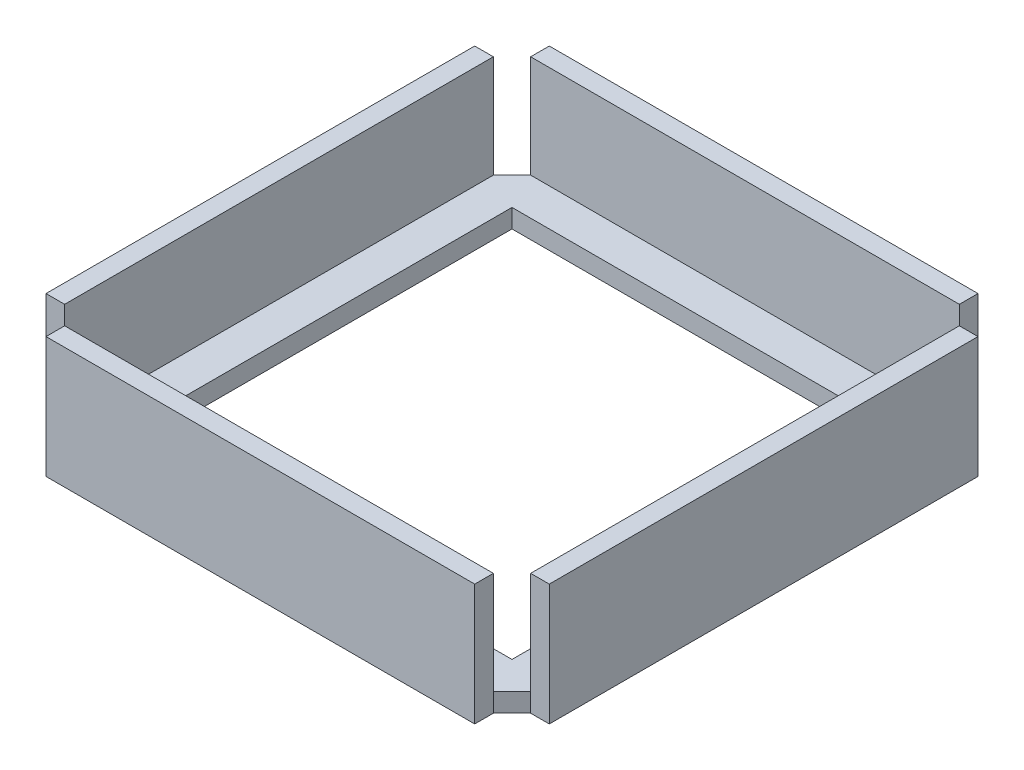
ISO-10303-21;
HEADER;
FILE_DESCRIPTION(('STEP AP214'),'2;1');
FILE_NAME('part.step','',(''),(''),'','','');
FILE_SCHEMA(('AUTOMOTIVE_DESIGN { 1 0 10303 214 1 1 1 1 }'));
ENDSEC;
DATA;
#1=APPLICATION_CONTEXT('core data for automotive mechanical design processes');
#2=APPLICATION_PROTOCOL_DEFINITION('international standard','automotive_design',2000,#1);
#3=PRODUCT_CONTEXT('',#1,'mechanical');
#4=PRODUCT('Part','Part','',(#3));
#5=PRODUCT_RELATED_PRODUCT_CATEGORY('part','',(#4));
#6=PRODUCT_DEFINITION_FORMATION('','',#4);
#7=PRODUCT_DEFINITION_CONTEXT('part definition',#1,'design');
#8=PRODUCT_DEFINITION('design','',#6,#7);
#9=PRODUCT_DEFINITION_SHAPE('','',#8);
#10=(LENGTH_UNIT() NAMED_UNIT(*) SI_UNIT(.MILLI.,.METRE.));
#11=(NAMED_UNIT(*) PLANE_ANGLE_UNIT() SI_UNIT($,.RADIAN.));
#12=(NAMED_UNIT(*) SI_UNIT($,.STERADIAN.) SOLID_ANGLE_UNIT());
#13=UNCERTAINTY_MEASURE_WITH_UNIT(LENGTH_MEASURE(1.E-05),#10,'distance_accuracy_value','');
#14=(GEOMETRIC_REPRESENTATION_CONTEXT(3) GLOBAL_UNCERTAINTY_ASSIGNED_CONTEXT((#13)) GLOBAL_UNIT_ASSIGNED_CONTEXT((#10,
#11,#12)) REPRESENTATION_CONTEXT('',''));
#15=CARTESIAN_POINT('',(0.,0.,0.));
#16=DIRECTION('',(0.,0.,1.));
#17=DIRECTION('',(1.,0.,0.));
#18=AXIS2_PLACEMENT_3D('',#15,#16,#17);
#19=CARTESIAN_POINT('',(-36.5000000000032,2.,-36.5000000000032));
#20=DIRECTION('',(0.707106781186547,0.,0.707106781186548));
#21=DIRECTION('',(0.707106781186548,0.,-0.707106781186547));
#22=AXIS2_PLACEMENT_3D('',#19,#20,#21);
#23=PLANE('',#22);
#24=DIRECTION('',(-0.707106781186548,0.,0.707106781186547));
#25=VECTOR('',#24,1.);
#26=CARTESIAN_POINT('',(-36.5000000000032,0.,-36.5000000000032));
#27=LINE('',#26,#25);
#28=CARTESIAN_POINT('',(-42.0000000000064,0.,-31.));
#29=VERTEX_POINT('',#28);
#30=CARTESIAN_POINT('',(-44.0000000000064,0.,-29.));
#31=VERTEX_POINT('',#30);
#32=EDGE_CURVE('E313',#29,#31,#27,.T.);
#33=ORIENTED_EDGE('',*,*,#32,.T.);
#34=DIRECTION('',(0.,-1.,0.));
#35=VECTOR('',#34,1.);
#36=CARTESIAN_POINT('',(-44.0000000000064,2.,-29.));
#37=LINE('',#36,#35);
#38=CARTESIAN_POINT('',(-44.0000000000064,2.00000000000001,-29.));
#39=VERTEX_POINT('',#38);
#40=EDGE_CURVE('E11',#39,#31,#37,.T.);
#41=ORIENTED_EDGE('',*,*,#40,.F.);
#42=DIRECTION('',(-0.707106781186548,0.,0.707106781186547));
#43=VECTOR('',#42,1.);
#44=CARTESIAN_POINT('',(-36.5000000000032,2.,-36.5000000000032));
#45=LINE('',#44,#43);
#46=CARTESIAN_POINT('',(-42.0000000000064,2.,-31.));
#47=VERTEX_POINT('',#46);
#48=EDGE_CURVE('E268',#47,#39,#45,.T.);
#49=ORIENTED_EDGE('',*,*,#48,.F.);
#50=DIRECTION('',(0.,-1.,0.));
#51=VECTOR('',#50,1.);
#52=CARTESIAN_POINT('',(-42.0000000000064,2.,-31.));
#53=LINE('',#52,#51);
#54=EDGE_CURVE('E241',#47,#29,#53,.T.);
#55=ORIENTED_EDGE('',*,*,#54,.T.);
#56=EDGE_LOOP('',(#33,#41,#49,#55));
#57=FACE_BOUND('',#56,.T.);
#58=ADVANCED_FACE('F34',(#57),#23,.F.);
#59=CARTESIAN_POINT('',(-30.5000000000028,2.,30.5000000000028));
#60=DIRECTION('',(0.707106781186547,0.,-0.707106781186547));
#61=DIRECTION('',(-0.707106781186548,0.,-0.707106781186548));
#62=AXIS2_PLACEMENT_3D('',#59,#60,#61);
#63=PLANE('',#62);
#64=DIRECTION('',(0.707106781186548,0.,0.707106781186548));
#65=VECTOR('',#64,1.);
#66=CARTESIAN_POINT('',(-30.5000000000028,0.,30.5000000000028));
#67=LINE('',#66,#65);
#68=CARTESIAN_POINT('',(-44.0000000000064,0.,16.9999999999992));
#69=VERTEX_POINT('',#68);
#70=CARTESIAN_POINT('',(-42.0000000000064,0.,18.9999999999992));
#71=VERTEX_POINT('',#70);
#72=EDGE_CURVE('E77',#69,#71,#67,.T.);
#73=ORIENTED_EDGE('',*,*,#72,.T.);
#74=DIRECTION('',(0.,-1.,0.));
#75=VECTOR('',#74,1.);
#76=CARTESIAN_POINT('',(-42.0000000000064,2.,18.9999999999992));
#77=LINE('',#76,#75);
#78=CARTESIAN_POINT('',(-42.0000000000064,2.00000000000001,18.9999999999992));
#79=VERTEX_POINT('',#78);
#80=EDGE_CURVE('E143',#79,#71,#77,.T.);
#81=ORIENTED_EDGE('',*,*,#80,.F.);
#82=DIRECTION('',(0.707106781186548,0.,0.707106781186548));
#83=VECTOR('',#82,1.);
#84=CARTESIAN_POINT('',(-30.5000000000028,2.,30.5000000000028));
#85=LINE('',#84,#83);
#86=CARTESIAN_POINT('',(-44.0000000000064,2.,16.9999999999992));
#87=VERTEX_POINT('',#86);
#88=EDGE_CURVE('E127',#87,#79,#85,.T.);
#89=ORIENTED_EDGE('',*,*,#88,.F.);
#90=DIRECTION('',(0.,-1.,0.));
#91=VECTOR('',#90,1.);
#92=CARTESIAN_POINT('',(-44.0000000000064,2.,16.9999999999992));
#93=LINE('',#92,#91);
#94=EDGE_CURVE('E44',#87,#69,#93,.T.);
#95=ORIENTED_EDGE('',*,*,#94,.T.);
#96=EDGE_LOOP('',(#73,#81,#89,#95));
#97=FACE_BOUND('',#96,.T.);
#98=ADVANCED_FACE('F347',(#97),#63,.F.);
#99=CARTESIAN_POINT('',(11.4999999999964,2.,11.4999999999964));
#100=DIRECTION('',(-0.707106781186549,0.,-0.707106781186546));
#101=DIRECTION('',(-0.707106781186546,0.,0.707106781186549));
#102=AXIS2_PLACEMENT_3D('',#99,#100,#101);
#103=PLANE('',#102);
#104=DIRECTION('',(0.707106781186546,0.,-0.707106781186549));
#105=VECTOR('',#104,1.);
#106=CARTESIAN_POINT('',(11.4999999999964,0.,11.4999999999964));
#107=LINE('',#106,#105);
#108=CARTESIAN_POINT('',(3.99999999999364,0.,18.9999999999992));
#109=VERTEX_POINT('',#108);
#110=CARTESIAN_POINT('',(5.99999999999363,0.,16.9999999999992));
#111=VERTEX_POINT('',#110);
#112=EDGE_CURVE('E310',#109,#111,#107,.T.);
#113=ORIENTED_EDGE('',*,*,#112,.T.);
#114=DIRECTION('',(0.,-1.,0.));
#115=VECTOR('',#114,1.);
#116=CARTESIAN_POINT('',(5.99999999999363,2.,16.9999999999992));
#117=LINE('',#116,#115);
#118=CARTESIAN_POINT('',(5.99999999999363,2.00000000000001,16.9999999999992));
#119=VERTEX_POINT('',#118);
#120=EDGE_CURVE('E115',#119,#111,#117,.T.);
#121=ORIENTED_EDGE('',*,*,#120,.F.);
#122=DIRECTION('',(0.707106781186546,0.,-0.707106781186549));
#123=VECTOR('',#122,1.);
#124=CARTESIAN_POINT('',(11.4999999999964,2.,11.4999999999964));
#125=LINE('',#124,#123);
#126=CARTESIAN_POINT('',(3.99999999999364,2.,18.9999999999992));
#127=VERTEX_POINT('',#126);
#128=EDGE_CURVE('E110',#127,#119,#125,.T.);
#129=ORIENTED_EDGE('',*,*,#128,.F.);
#130=DIRECTION('',(0.,-1.,0.));
#131=VECTOR('',#130,1.);
#132=CARTESIAN_POINT('',(3.99999999999364,2.,18.9999999999992));
#133=LINE('',#132,#131);
#134=EDGE_CURVE('E85',#127,#109,#133,.T.);
#135=ORIENTED_EDGE('',*,*,#134,.T.);
#136=EDGE_LOOP('',(#113,#121,#129,#135));
#137=FACE_BOUND('',#136,.T.);
#138=ADVANCED_FACE('F112',(#137),#103,.F.);
#139=CARTESIAN_POINT('',(17.4999999999968,2.,-17.4999999999969));
#140=DIRECTION('',(-0.707106781186547,0.,0.707106781186548));
#141=DIRECTION('',(0.707106781186548,0.,0.707106781186547));
#142=AXIS2_PLACEMENT_3D('',#139,#140,#141);
#143=PLANE('',#142);
#144=DIRECTION('',(-0.707106781186548,0.,-0.707106781186547));
#145=VECTOR('',#144,1.);
#146=CARTESIAN_POINT('',(17.4999999999968,0.,-17.4999999999969));
#147=LINE('',#146,#145);
#148=CARTESIAN_POINT('',(5.99999999999364,0.,-29.));
#149=VERTEX_POINT('',#148);
#150=CARTESIAN_POINT('',(3.99999999999364,0.,-31.));
#151=VERTEX_POINT('',#150);
#152=EDGE_CURVE('E239',#149,#151,#147,.T.);
#153=ORIENTED_EDGE('',*,*,#152,.T.);
#154=DIRECTION('',(0.,-1.,0.));
#155=VECTOR('',#154,1.);
#156=CARTESIAN_POINT('',(3.99999999999364,2.,-31.));
#157=LINE('',#156,#155);
#158=CARTESIAN_POINT('',(3.99999999999364,2.00000000000001,-31.));
#159=VERTEX_POINT('',#158);
#160=EDGE_CURVE('E218',#159,#151,#157,.T.);
#161=ORIENTED_EDGE('',*,*,#160,.F.);
#162=DIRECTION('',(-0.707106781186548,0.,-0.707106781186547));
#163=VECTOR('',#162,1.);
#164=CARTESIAN_POINT('',(17.4999999999968,2.,-17.4999999999969));
#165=LINE('',#164,#163);
#166=CARTESIAN_POINT('',(5.99999999999364,2.,-29.));
#167=VERTEX_POINT('',#166);
#168=EDGE_CURVE('E229',#167,#159,#165,.T.);
#169=ORIENTED_EDGE('',*,*,#168,.F.);
#170=DIRECTION('',(0.,-1.,0.));
#171=VECTOR('',#170,1.);
#172=CARTESIAN_POINT('',(5.99999999999364,2.,-29.));
#173=LINE('',#172,#171);
#174=EDGE_CURVE('E240',#167,#149,#173,.T.);
#175=ORIENTED_EDGE('',*,*,#174,.T.);
#176=EDGE_LOOP('',(#153,#161,#169,#175));
#177=FACE_BOUND('',#176,.T.);
#178=ADVANCED_FACE('F237',(#177),#143,.F.);
#179=CARTESIAN_POINT('',(0.,2.,-27.));
#180=DIRECTION('',(0.,0.,-1.));
#181=DIRECTION('',(-1.,0.,0.));
#182=AXIS2_PLACEMENT_3D('',#179,#180,#181);
#183=PLANE('',#182);
#184=DIRECTION('',(1.,0.,0.));
#185=VECTOR('',#184,1.);
#186=CARTESIAN_POINT('',(0.,0.,-27.));
#187=LINE('',#186,#185);
#188=CARTESIAN_POINT('',(-40.,0.,-27.));
#189=VERTEX_POINT('',#188);
#190=CARTESIAN_POINT('',(1.99999999999999,0.,-27.));
#191=VERTEX_POINT('',#190);
#192=EDGE_CURVE('E150',#189,#191,#187,.T.);
#193=ORIENTED_EDGE('',*,*,#192,.T.);
#194=DIRECTION('',(0.,-1.,0.));
#195=VECTOR('',#194,1.);
#196=CARTESIAN_POINT('',(1.99999999999999,2.,-27.));
#197=LINE('',#196,#195);
#198=CARTESIAN_POINT('',(1.99999999999999,2.,-27.));
#199=VERTEX_POINT('',#198);
#200=EDGE_CURVE('E245',#199,#191,#197,.T.);
#201=ORIENTED_EDGE('',*,*,#200,.F.);
#202=DIRECTION('',(1.,0.,0.));
#203=VECTOR('',#202,1.);
#204=CARTESIAN_POINT('',(0.,2.,-27.));
#205=LINE('',#204,#203);
#206=CARTESIAN_POINT('',(-40.,2.,-27.));
#207=VERTEX_POINT('',#206);
#208=EDGE_CURVE('E161',#207,#199,#205,.T.);
#209=ORIENTED_EDGE('',*,*,#208,.F.);
#210=DIRECTION('',(0.,-1.,0.));
#211=VECTOR('',#210,1.);
#212=CARTESIAN_POINT('',(-40.,2.,-27.));
#213=LINE('',#212,#211);
#214=EDGE_CURVE('E263',#207,#189,#213,.T.);
#215=ORIENTED_EDGE('',*,*,#214,.T.);
#216=EDGE_LOOP('',(#193,#201,#209,#215));
#217=FACE_BOUND('',#216,.T.);
#218=ADVANCED_FACE('F36',(#217),#183,.F.);
#219=CARTESIAN_POINT('',(2.,2.,0.));
#220=DIRECTION('',(1.,0.,0.));
#221=DIRECTION('',(0.,0.,-1.));
#222=AXIS2_PLACEMENT_3D('',#219,#220,#221);
#223=PLANE('',#222);
#224=DIRECTION('',(0.,0.,1.));
#225=VECTOR('',#224,1.);
#226=CARTESIAN_POINT('',(2.,0.,0.));
#227=LINE('',#226,#225);
#228=CARTESIAN_POINT('',(2.,0.,15.));
#229=VERTEX_POINT('',#228);
#230=EDGE_CURVE('E154',#191,#229,#227,.T.);
#231=ORIENTED_EDGE('',*,*,#230,.T.);
#232=DIRECTION('',(0.,-1.,0.));
#233=VECTOR('',#232,1.);
#234=CARTESIAN_POINT('',(2.,2.,15.));
#235=LINE('',#234,#233);
#236=CARTESIAN_POINT('',(2.,2.,15.));
#237=VERTEX_POINT('',#236);
#238=EDGE_CURVE('E304',#237,#229,#235,.T.);
#239=ORIENTED_EDGE('',*,*,#238,.F.);
#240=DIRECTION('',(0.,0.,1.));
#241=VECTOR('',#240,1.);
#242=CARTESIAN_POINT('',(2.,2.,0.));
#243=LINE('',#242,#241);
#244=EDGE_CURVE('E94',#199,#237,#243,.T.);
#245=ORIENTED_EDGE('',*,*,#244,.F.);
#246=ORIENTED_EDGE('',*,*,#200,.T.);
#247=EDGE_LOOP('',(#231,#239,#245,#246));
#248=FACE_BOUND('',#247,.T.);
#249=ADVANCED_FACE('F322',(#248),#223,.F.);
#250=CARTESIAN_POINT('',(0.,2.,15.));
#251=DIRECTION('',(0.,0.,-1.));
#252=DIRECTION('',(-1.,0.,0.));
#253=AXIS2_PLACEMENT_3D('',#250,#251,#252);
#254=PLANE('',#253);
#255=DIRECTION('',(1.,0.,0.));
#256=VECTOR('',#255,1.);
#257=CARTESIAN_POINT('',(0.,0.,15.));
#258=LINE('',#257,#256);
#259=CARTESIAN_POINT('',(-40.,0.,15.));
#260=VERTEX_POINT('',#259);
#261=EDGE_CURVE('E319',#260,#229,#258,.T.);
#262=ORIENTED_EDGE('',*,*,#261,.F.);
#263=DIRECTION('',(0.,-1.,0.));
#264=VECTOR('',#263,1.);
#265=CARTESIAN_POINT('',(-40.,2.,15.));
#266=LINE('',#265,#264);
#267=CARTESIAN_POINT('',(-40.,2.,15.));
#268=VERTEX_POINT('',#267);
#269=EDGE_CURVE('E306',#268,#260,#266,.T.);
#270=ORIENTED_EDGE('',*,*,#269,.F.);
#271=DIRECTION('',(1.,0.,0.));
#272=VECTOR('',#271,1.);
#273=CARTESIAN_POINT('',(0.,2.,15.));
#274=LINE('',#273,#272);
#275=EDGE_CURVE('E277',#268,#237,#274,.T.);
#276=ORIENTED_EDGE('',*,*,#275,.T.);
#277=ORIENTED_EDGE('',*,*,#238,.T.);
#278=EDGE_LOOP('',(#262,#270,#276,#277));
#279=FACE_BOUND('',#278,.T.);
#280=ADVANCED_FACE('F331',(#279),#254,.T.);
#281=CARTESIAN_POINT('',(-40.,2.,0.));
#282=DIRECTION('',(1.,0.,0.));
#283=DIRECTION('',(0.,0.,-1.));
#284=AXIS2_PLACEMENT_3D('',#281,#282,#283);
#285=PLANE('',#284);
#286=DIRECTION('',(0.,0.,1.));
#287=VECTOR('',#286,1.);
#288=CARTESIAN_POINT('',(-40.,0.,0.));
#289=LINE('',#288,#287);
#290=EDGE_CURVE('E316',#189,#260,#289,.T.);
#291=ORIENTED_EDGE('',*,*,#290,.F.);
#292=ORIENTED_EDGE('',*,*,#214,.F.);
#293=DIRECTION('',(0.,0.,1.));
#294=VECTOR('',#293,1.);
#295=CARTESIAN_POINT('',(-40.,2.,0.));
#296=LINE('',#295,#294);
#297=EDGE_CURVE('E271',#207,#268,#296,.T.);
#298=ORIENTED_EDGE('',*,*,#297,.T.);
#299=ORIENTED_EDGE('',*,*,#269,.T.);
#300=EDGE_LOOP('',(#291,#292,#298,#299));
#301=FACE_BOUND('',#300,.T.);
#302=ADVANCED_FACE('F336',(#301),#285,.T.);
#303=CARTESIAN_POINT('',(0.,2.,0.));
#304=DIRECTION('',(0.,1.,0.));
#305=DIRECTION('',(0.,0.,1.));
#306=AXIS2_PLACEMENT_3D('',#303,#304,#305);
#307=PLANE('',#306);
#308=ORIENTED_EDGE('',*,*,#208,.T.);
#309=ORIENTED_EDGE('',*,*,#244,.T.);
#310=ORIENTED_EDGE('',*,*,#275,.F.);
#311=ORIENTED_EDGE('',*,*,#297,.F.);
#312=EDGE_LOOP('',(#308,#309,#310,#311));
#313=FACE_BOUND('',#312,.T.);
#314=ORIENTED_EDGE('',*,*,#48,.T.);
#315=DIRECTION('',(0.,0.,1.));
#316=VECTOR('',#315,1.);
#317=CARTESIAN_POINT('',(-44.0000000000064,2.,0.));
#318=LINE('',#317,#316);
#319=EDGE_CURVE('E270',#39,#87,#318,.T.);
#320=ORIENTED_EDGE('',*,*,#319,.T.);
#321=ORIENTED_EDGE('',*,*,#88,.T.);
#322=DIRECTION('',(-1.,0.,0.));
#323=VECTOR('',#322,1.);
#324=CARTESIAN_POINT('',(0.,2.,18.9999999999992));
#325=LINE('',#324,#323);
#326=EDGE_CURVE('E119',#127,#79,#325,.T.);
#327=ORIENTED_EDGE('',*,*,#326,.F.);
#328=ORIENTED_EDGE('',*,*,#128,.T.);
#329=DIRECTION('',(0.,0.,-1.));
#330=VECTOR('',#329,1.);
#331=CARTESIAN_POINT('',(5.99999999999363,2.,0.));
#332=LINE('',#331,#330);
#333=EDGE_CURVE('E118',#119,#167,#332,.T.);
#334=ORIENTED_EDGE('',*,*,#333,.T.);
#335=ORIENTED_EDGE('',*,*,#168,.T.);
#336=DIRECTION('',(-1.,0.,0.));
#337=VECTOR('',#336,1.);
#338=CARTESIAN_POINT('',(0.,2.,-31.));
#339=LINE('',#338,#337);
#340=EDGE_CURVE('E230',#159,#47,#339,.T.);
#341=ORIENTED_EDGE('',*,*,#340,.T.);
#342=EDGE_LOOP('',(#314,#320,#321,#327,#328,#334,#335,#341));
#343=FACE_BOUND('',#342,.T.);
#344=ADVANCED_FACE('F124',(#313,#343),#307,.T.);
#345=CARTESIAN_POINT('',(0.,0.,0.));
#346=DIRECTION('',(0.,1.,0.));
#347=DIRECTION('',(0.,0.,1.));
#348=AXIS2_PLACEMENT_3D('',#345,#346,#347);
#349=PLANE('',#348);
#350=ORIENTED_EDGE('',*,*,#192,.F.);
#351=ORIENTED_EDGE('',*,*,#290,.T.);
#352=ORIENTED_EDGE('',*,*,#261,.T.);
#353=ORIENTED_EDGE('',*,*,#230,.F.);
#354=EDGE_LOOP('',(#350,#351,#352,#353));
#355=FACE_BOUND('',#354,.T.);
#356=ORIENTED_EDGE('',*,*,#32,.F.);
#357=DIRECTION('',(0.,0.,1.));
#358=VECTOR('',#357,1.);
#359=CARTESIAN_POINT('',(-42.0000000000064,0.,0.));
#360=LINE('',#359,#358);
#361=CARTESIAN_POINT('',(-42.0000000000064,0.,-33.0000000000312));
#362=VERTEX_POINT('',#361);
#363=EDGE_CURVE('E195',#362,#29,#360,.T.);
#364=ORIENTED_EDGE('',*,*,#363,.F.);
#365=DIRECTION('',(1.,0.,0.));
#366=VECTOR('',#365,1.);
#367=CARTESIAN_POINT('',(0.,0.,-33.0000000000312));
#368=LINE('',#367,#366);
#369=CARTESIAN_POINT('',(3.99999999999364,0.,-33.0000000000312));
#370=VERTEX_POINT('',#369);
#371=EDGE_CURVE('E513',#362,#370,#368,.T.);
#372=ORIENTED_EDGE('',*,*,#371,.T.);
#373=DIRECTION('',(0.,0.,1.));
#374=VECTOR('',#373,1.);
#375=CARTESIAN_POINT('',(3.99999999999367,0.,0.));
#376=LINE('',#375,#374);
#377=EDGE_CURVE('E512',#370,#151,#376,.T.);
#378=ORIENTED_EDGE('',*,*,#377,.T.);
#379=ORIENTED_EDGE('',*,*,#152,.F.);
#380=DIRECTION('',(1.,0.,0.));
#381=VECTOR('',#380,1.);
#382=CARTESIAN_POINT('',(0.,0.,-29.));
#383=LINE('',#382,#381);
#384=CARTESIAN_POINT('',(8.00000000000005,0.,-29.));
#385=VERTEX_POINT('',#384);
#386=EDGE_CURVE('E478',#149,#385,#383,.T.);
#387=ORIENTED_EDGE('',*,*,#386,.T.);
#388=DIRECTION('',(0.,0.,1.));
#389=VECTOR('',#388,1.);
#390=CARTESIAN_POINT('',(8.00000000000006,0.,0.));
#391=LINE('',#390,#389);
#392=CARTESIAN_POINT('',(8.00000000000006,0.,16.9999999999992));
#393=VERTEX_POINT('',#392);
#394=EDGE_CURVE('E491',#385,#393,#391,.T.);
#395=ORIENTED_EDGE('',*,*,#394,.T.);
#396=DIRECTION('',(-1.,0.,0.));
#397=VECTOR('',#396,1.);
#398=CARTESIAN_POINT('',(0.,0.,16.9999999999992));
#399=LINE('',#398,#397);
#400=EDGE_CURVE('E488',#393,#111,#399,.T.);
#401=ORIENTED_EDGE('',*,*,#400,.T.);
#402=ORIENTED_EDGE('',*,*,#112,.F.);
#403=DIRECTION('',(0.,0.,-1.));
#404=VECTOR('',#403,1.);
#405=CARTESIAN_POINT('',(3.99999999999364,0.,0.));
#406=LINE('',#405,#404);
#407=CARTESIAN_POINT('',(3.99999999999364,0.,20.9999999999621));
#408=VERTEX_POINT('',#407);
#409=EDGE_CURVE('E142',#408,#109,#406,.T.);
#410=ORIENTED_EDGE('',*,*,#409,.F.);
#411=DIRECTION('',(1.,0.,0.));
#412=VECTOR('',#411,1.);
#413=CARTESIAN_POINT('',(0.,0.,20.9999999999621));
#414=LINE('',#413,#412);
#415=CARTESIAN_POINT('',(-42.0000000000064,0.,20.9999999999621));
#416=VERTEX_POINT('',#415);
#417=EDGE_CURVE('E171',#416,#408,#414,.T.);
#418=ORIENTED_EDGE('',*,*,#417,.F.);
#419=DIRECTION('',(0.,0.,-1.));
#420=VECTOR('',#419,1.);
#421=CARTESIAN_POINT('',(-42.0000000000064,0.,0.));
#422=LINE('',#421,#420);
#423=EDGE_CURVE('E175',#416,#71,#422,.T.);
#424=ORIENTED_EDGE('',*,*,#423,.T.);
#425=ORIENTED_EDGE('',*,*,#72,.F.);
#426=DIRECTION('',(1.,0.,0.));
#427=VECTOR('',#426,1.);
#428=CARTESIAN_POINT('',(0.,0.,16.9999999999992));
#429=LINE('',#428,#427);
#430=CARTESIAN_POINT('',(-45.9999999999914,0.,16.9999999999992));
#431=VERTEX_POINT('',#430);
#432=EDGE_CURVE('E449',#431,#69,#429,.T.);
#433=ORIENTED_EDGE('',*,*,#432,.F.);
#434=DIRECTION('',(0.,0.,1.));
#435=VECTOR('',#434,1.);
#436=CARTESIAN_POINT('',(-45.9999999999914,0.,0.));
#437=LINE('',#436,#435);
#438=CARTESIAN_POINT('',(-45.9999999999914,0.,-29.));
#439=VERTEX_POINT('',#438);
#440=EDGE_CURVE('E454',#439,#431,#437,.T.);
#441=ORIENTED_EDGE('',*,*,#440,.F.);
#442=DIRECTION('',(-1.,0.,0.));
#443=VECTOR('',#442,1.);
#444=CARTESIAN_POINT('',(0.,0.,-29.0000000000001));
#445=LINE('',#444,#443);
#446=EDGE_CURVE('E460',#31,#439,#445,.T.);
#447=ORIENTED_EDGE('',*,*,#446,.F.);
#448=EDGE_LOOP('',(#356,#364,#372,#378,#379,#387,#395,#401,#402,#410,#418,#424,#425,#433,#441,#447));
#449=FACE_BOUND('',#448,.T.);
#450=ADVANCED_FACE('F327',(#355,#449),#349,.F.);
#451=CARTESIAN_POINT('',(0.,13.,18.9999999999992));
#452=DIRECTION('',(0.,0.,1.));
#453=DIRECTION('',(1.,0.,0.));
#454=AXIS2_PLACEMENT_3D('',#451,#452,#453);
#455=PLANE('',#454);
#456=DIRECTION('',(0.,-1.,0.));
#457=VECTOR('',#456,1.);
#458=CARTESIAN_POINT('',(3.99999999999364,13.,18.9999999999992));
#459=LINE('',#458,#457);
#460=CARTESIAN_POINT('',(3.99999999999364,13.,18.9999999999992));
#461=VERTEX_POINT('',#460);
#462=EDGE_CURVE('E139',#461,#127,#459,.T.);
#463=ORIENTED_EDGE('',*,*,#462,.T.);
#464=ORIENTED_EDGE('',*,*,#326,.T.);
#465=DIRECTION('',(0.,-1.,0.));
#466=VECTOR('',#465,1.);
#467=CARTESIAN_POINT('',(-42.0000000000064,13.,18.9999999999992));
#468=LINE('',#467,#466);
#469=CARTESIAN_POINT('',(-42.0000000000064,13.,18.9999999999992));
#470=VERTEX_POINT('',#469);
#471=EDGE_CURVE('E151',#470,#79,#468,.T.);
#472=ORIENTED_EDGE('',*,*,#471,.F.);
#473=DIRECTION('',(-1.,0.,0.));
#474=VECTOR('',#473,1.);
#475=CARTESIAN_POINT('',(0.,13.,18.9999999999992));
#476=LINE('',#475,#474);
#477=EDGE_CURVE('E148',#461,#470,#476,.T.);
#478=ORIENTED_EDGE('',*,*,#477,.F.);
#479=EDGE_LOOP('',(#463,#464,#472,#478));
#480=FACE_BOUND('',#479,.T.);
#481=ADVANCED_FACE('F146',(#480),#455,.F.);
#482=CARTESIAN_POINT('',(3.99999999999364,13.,0.));
#483=DIRECTION('',(-1.,0.,0.));
#484=DIRECTION('',(0.,0.,1.));
#485=AXIS2_PLACEMENT_3D('',#482,#483,#484);
#486=PLANE('',#485);
#487=ORIENTED_EDGE('',*,*,#409,.T.);
#488=ORIENTED_EDGE('',*,*,#134,.F.);
#489=ORIENTED_EDGE('',*,*,#462,.F.);
#490=DIRECTION('',(0.,0.,-1.));
#491=VECTOR('',#490,1.);
#492=CARTESIAN_POINT('',(3.99999999999364,13.,0.));
#493=LINE('',#492,#491);
#494=CARTESIAN_POINT('',(3.99999999999364,13.,20.9999999999621));
#495=VERTEX_POINT('',#494);
#496=EDGE_CURVE('E174',#495,#461,#493,.T.);
#497=ORIENTED_EDGE('',*,*,#496,.F.);
#498=DIRECTION('',(0.,-1.,0.));
#499=VECTOR('',#498,1.);
#500=CARTESIAN_POINT('',(3.99999999999364,13.,20.9999999999621));
#501=LINE('',#500,#499);
#502=EDGE_CURVE('E168',#495,#408,#501,.T.);
#503=ORIENTED_EDGE('',*,*,#502,.T.);
#504=EDGE_LOOP('',(#487,#488,#489,#497,#503));
#505=FACE_BOUND('',#504,.T.);
#506=ADVANCED_FACE('F136',(#505),#486,.F.);
#507=CARTESIAN_POINT('',(-42.0000000000064,13.,0.));
#508=DIRECTION('',(-1.,0.,0.));
#509=DIRECTION('',(0.,0.,1.));
#510=AXIS2_PLACEMENT_3D('',#507,#508,#509);
#511=PLANE('',#510);
#512=ORIENTED_EDGE('',*,*,#423,.F.);
#513=DIRECTION('',(0.,-1.,0.));
#514=VECTOR('',#513,1.);
#515=CARTESIAN_POINT('',(-42.0000000000064,13.,20.9999999999621));
#516=LINE('',#515,#514);
#517=CARTESIAN_POINT('',(-42.0000000000064,13.,20.9999999999621));
#518=VERTEX_POINT('',#517);
#519=EDGE_CURVE('E156',#518,#416,#516,.T.);
#520=ORIENTED_EDGE('',*,*,#519,.F.);
#521=DIRECTION('',(0.,0.,-1.));
#522=VECTOR('',#521,1.);
#523=CARTESIAN_POINT('',(-42.0000000000064,13.,0.));
#524=LINE('',#523,#522);
#525=EDGE_CURVE('E182',#518,#470,#524,.T.);
#526=ORIENTED_EDGE('',*,*,#525,.T.);
#527=ORIENTED_EDGE('',*,*,#471,.T.);
#528=ORIENTED_EDGE('',*,*,#80,.T.);
#529=EDGE_LOOP('',(#512,#520,#526,#527,#528));
#530=FACE_BOUND('',#529,.T.);
#531=ADVANCED_FACE('F362',(#530),#511,.T.);
#532=CARTESIAN_POINT('',(0.,13.,20.9999999999621));
#533=DIRECTION('',(0.,0.,-1.));
#534=DIRECTION('',(-1.,0.,0.));
#535=AXIS2_PLACEMENT_3D('',#532,#533,#534);
#536=PLANE('',#535);
#537=ORIENTED_EDGE('',*,*,#417,.T.);
#538=ORIENTED_EDGE('',*,*,#502,.F.);
#539=DIRECTION('',(1.,0.,0.));
#540=VECTOR('',#539,1.);
#541=CARTESIAN_POINT('',(0.,13.,20.9999999999621));
#542=LINE('',#541,#540);
#543=EDGE_CURVE('E170',#518,#495,#542,.T.);
#544=ORIENTED_EDGE('',*,*,#543,.F.);
#545=ORIENTED_EDGE('',*,*,#519,.T.);
#546=EDGE_LOOP('',(#537,#538,#544,#545));
#547=FACE_BOUND('',#546,.T.);
#548=ADVANCED_FACE('F367',(#547),#536,.F.);
#549=CARTESIAN_POINT('',(0.,13.,0.));
#550=DIRECTION('',(0.,1.,0.));
#551=DIRECTION('',(0.,0.,1.));
#552=AXIS2_PLACEMENT_3D('',#549,#550,#551);
#553=PLANE('',#552);
#554=ORIENTED_EDGE('',*,*,#496,.T.);
#555=ORIENTED_EDGE('',*,*,#477,.T.);
#556=ORIENTED_EDGE('',*,*,#525,.F.);
#557=ORIENTED_EDGE('',*,*,#543,.T.);
#558=EDGE_LOOP('',(#554,#555,#556,#557));
#559=FACE_BOUND('',#558,.T.);
#560=ADVANCED_FACE('F370',(#559),#553,.T.);
#561=CARTESIAN_POINT('',(0.,13.,-31.));
#562=DIRECTION('',(0.,0.,1.));
#563=DIRECTION('',(1.,0.,0.));
#564=AXIS2_PLACEMENT_3D('',#561,#562,#563);
#565=PLANE('',#564);
#566=ORIENTED_EDGE('',*,*,#340,.F.);
#567=DIRECTION('',(0.,-1.,0.));
#568=VECTOR('',#567,1.);
#569=CARTESIAN_POINT('',(3.99999999999364,13.,-31.));
#570=LINE('',#569,#568);
#571=CARTESIAN_POINT('',(3.99999999999364,13.,-31.));
#572=VERTEX_POINT('',#571);
#573=EDGE_CURVE('E179',#572,#159,#570,.T.);
#574=ORIENTED_EDGE('',*,*,#573,.F.);
#575=DIRECTION('',(-1.,0.,0.));
#576=VECTOR('',#575,1.);
#577=CARTESIAN_POINT('',(0.,13.,-31.));
#578=LINE('',#577,#576);
#579=CARTESIAN_POINT('',(-42.0000000000064,13.,-31.));
#580=VERTEX_POINT('',#579);
#581=EDGE_CURVE('E505',#572,#580,#578,.T.);
#582=ORIENTED_EDGE('',*,*,#581,.T.);
#583=DIRECTION('',(0.,-1.,0.));
#584=VECTOR('',#583,1.);
#585=CARTESIAN_POINT('',(-42.0000000000064,13.,-31.));
#586=LINE('',#585,#584);
#587=EDGE_CURVE('E52',#580,#47,#586,.T.);
#588=ORIENTED_EDGE('',*,*,#587,.T.);
#589=EDGE_LOOP('',(#566,#574,#582,#588));
#590=FACE_BOUND('',#589,.T.);
#591=ADVANCED_FACE('F374',(#590),#565,.T.);
#592=CARTESIAN_POINT('',(3.99999999999367,13.,0.));
#593=DIRECTION('',(1.,0.,0.));
#594=DIRECTION('',(0.,0.,-1.));
#595=AXIS2_PLACEMENT_3D('',#592,#593,#594);
#596=PLANE('',#595);
#597=ORIENTED_EDGE('',*,*,#377,.F.);
#598=DIRECTION('',(0.,-1.,0.));
#599=VECTOR('',#598,1.);
#600=CARTESIAN_POINT('',(3.99999999999364,13.,-33.0000000000312));
#601=LINE('',#600,#599);
#602=CARTESIAN_POINT('',(3.99999999999364,13.,-33.0000000000312));
#603=VERTEX_POINT('',#602);
#604=EDGE_CURVE('E199',#603,#370,#601,.T.);
#605=ORIENTED_EDGE('',*,*,#604,.F.);
#606=DIRECTION('',(0.,0.,1.));
#607=VECTOR('',#606,1.);
#608=CARTESIAN_POINT('',(3.99999999999367,13.,0.));
#609=LINE('',#608,#607);
#610=EDGE_CURVE('E222',#603,#572,#609,.T.);
#611=ORIENTED_EDGE('',*,*,#610,.T.);
#612=ORIENTED_EDGE('',*,*,#573,.T.);
#613=ORIENTED_EDGE('',*,*,#160,.T.);
#614=EDGE_LOOP('',(#597,#605,#611,#612,#613));
#615=FACE_BOUND('',#614,.T.);
#616=ADVANCED_FACE('F215',(#615),#596,.T.);
#617=CARTESIAN_POINT('',(0.,13.,-33.0000000000312));
#618=DIRECTION('',(0.,0.,-1.));
#619=DIRECTION('',(-1.,0.,0.));
#620=AXIS2_PLACEMENT_3D('',#617,#618,#619);
#621=PLANE('',#620);
#622=ORIENTED_EDGE('',*,*,#371,.F.);
#623=DIRECTION('',(0.,-1.,0.));
#624=VECTOR('',#623,1.);
#625=CARTESIAN_POINT('',(-42.0000000000064,13.,-33.0000000000312));
#626=LINE('',#625,#624);
#627=CARTESIAN_POINT('',(-42.0000000000064,13.,-33.0000000000312));
#628=VERTEX_POINT('',#627);
#629=EDGE_CURVE('E189',#628,#362,#626,.T.);
#630=ORIENTED_EDGE('',*,*,#629,.F.);
#631=DIRECTION('',(1.,0.,0.));
#632=VECTOR('',#631,1.);
#633=CARTESIAN_POINT('',(0.,13.,-33.0000000000312));
#634=LINE('',#633,#632);
#635=EDGE_CURVE('E508',#628,#603,#634,.T.);
#636=ORIENTED_EDGE('',*,*,#635,.T.);
#637=ORIENTED_EDGE('',*,*,#604,.T.);
#638=EDGE_LOOP('',(#622,#630,#636,#637));
#639=FACE_BOUND('',#638,.T.);
#640=ADVANCED_FACE('F380',(#639),#621,.T.);
#641=CARTESIAN_POINT('',(-42.0000000000064,13.,0.));
#642=DIRECTION('',(1.,0.,0.));
#643=DIRECTION('',(0.,0.,-1.));
#644=AXIS2_PLACEMENT_3D('',#641,#642,#643);
#645=PLANE('',#644);
#646=ORIENTED_EDGE('',*,*,#363,.T.);
#647=ORIENTED_EDGE('',*,*,#54,.F.);
#648=ORIENTED_EDGE('',*,*,#587,.F.);
#649=DIRECTION('',(0.,0.,1.));
#650=VECTOR('',#649,1.);
#651=CARTESIAN_POINT('',(-42.0000000000064,13.,0.));
#652=LINE('',#651,#650);
#653=EDGE_CURVE('E190',#628,#580,#652,.T.);
#654=ORIENTED_EDGE('',*,*,#653,.F.);
#655=ORIENTED_EDGE('',*,*,#629,.T.);
#656=EDGE_LOOP('',(#646,#647,#648,#654,#655));
#657=FACE_BOUND('',#656,.T.);
#658=ADVANCED_FACE('F383',(#657),#645,.F.);
#659=CARTESIAN_POINT('',(0.,13.,0.));
#660=DIRECTION('',(0.,1.,0.));
#661=DIRECTION('',(0.,0.,1.));
#662=AXIS2_PLACEMENT_3D('',#659,#660,#661);
#663=PLANE('',#662);
#664=ORIENTED_EDGE('',*,*,#581,.F.);
#665=ORIENTED_EDGE('',*,*,#610,.F.);
#666=ORIENTED_EDGE('',*,*,#635,.F.);
#667=ORIENTED_EDGE('',*,*,#653,.T.);
#668=EDGE_LOOP('',(#664,#665,#666,#667));
#669=FACE_BOUND('',#668,.T.);
#670=ADVANCED_FACE('F386',(#669),#663,.T.);
#671=CARTESIAN_POINT('',(5.99999999999363,13.,0.));
#672=DIRECTION('',(-1.,0.,0.));
#673=DIRECTION('',(0.,0.,1.));
#674=AXIS2_PLACEMENT_3D('',#671,#672,#673);
#675=PLANE('',#674);
#676=ORIENTED_EDGE('',*,*,#333,.F.);
#677=DIRECTION('',(0.,-1.,0.));
#678=VECTOR('',#677,1.);
#679=CARTESIAN_POINT('',(5.99999999999363,13.,16.9999999999992));
#680=LINE('',#679,#678);
#681=CARTESIAN_POINT('',(5.99999999999363,13.,16.9999999999992));
#682=VERTEX_POINT('',#681);
#683=EDGE_CURVE('E503',#682,#119,#680,.T.);
#684=ORIENTED_EDGE('',*,*,#683,.F.);
#685=DIRECTION('',(0.,0.,-1.));
#686=VECTOR('',#685,1.);
#687=CARTESIAN_POINT('',(5.99999999999363,13.,0.));
#688=LINE('',#687,#686);
#689=CARTESIAN_POINT('',(5.99999999999364,13.,-29.));
#690=VERTEX_POINT('',#689);
#691=EDGE_CURVE('E474',#682,#690,#688,.T.);
#692=ORIENTED_EDGE('',*,*,#691,.T.);
#693=DIRECTION('',(0.,-1.,0.));
#694=VECTOR('',#693,1.);
#695=CARTESIAN_POINT('',(5.99999999999364,13.,-29.));
#696=LINE('',#695,#694);
#697=EDGE_CURVE('E487',#690,#167,#696,.T.);
#698=ORIENTED_EDGE('',*,*,#697,.T.);
#699=EDGE_LOOP('',(#676,#684,#692,#698));
#700=FACE_BOUND('',#699,.T.);
#701=ADVANCED_FACE('F390',(#700),#675,.T.);
#702=CARTESIAN_POINT('',(0.,13.,16.9999999999992));
#703=DIRECTION('',(0.,0.,1.));
#704=DIRECTION('',(1.,0.,0.));
#705=AXIS2_PLACEMENT_3D('',#702,#703,#704);
#706=PLANE('',#705);
#707=ORIENTED_EDGE('',*,*,#400,.F.);
#708=DIRECTION('',(0.,-1.,0.));
#709=VECTOR('',#708,1.);
#710=CARTESIAN_POINT('',(8.00000000000006,13.,16.9999999999992));
#711=LINE('',#710,#709);
#712=CARTESIAN_POINT('',(8.00000000000006,13.,16.9999999999992));
#713=VERTEX_POINT('',#712);
#714=EDGE_CURVE('E591',#713,#393,#711,.T.);
#715=ORIENTED_EDGE('',*,*,#714,.F.);
#716=DIRECTION('',(-1.,0.,0.));
#717=VECTOR('',#716,1.);
#718=CARTESIAN_POINT('',(0.,13.,16.9999999999992));
#719=LINE('',#718,#717);
#720=EDGE_CURVE('E477',#713,#682,#719,.T.);
#721=ORIENTED_EDGE('',*,*,#720,.T.);
#722=ORIENTED_EDGE('',*,*,#683,.T.);
#723=ORIENTED_EDGE('',*,*,#120,.T.);
#724=EDGE_LOOP('',(#707,#715,#721,#722,#723));
#725=FACE_BOUND('',#724,.T.);
#726=ADVANCED_FACE('F394',(#725),#706,.T.);
#727=CARTESIAN_POINT('',(8.00000000000006,13.,0.));
#728=DIRECTION('',(1.,0.,0.));
#729=DIRECTION('',(0.,0.,-1.));
#730=AXIS2_PLACEMENT_3D('',#727,#728,#729);
#731=PLANE('',#730);
#732=ORIENTED_EDGE('',*,*,#394,.F.);
#733=DIRECTION('',(0.,-1.,0.));
#734=VECTOR('',#733,1.);
#735=CARTESIAN_POINT('',(8.00000000000005,13.,-29.));
#736=LINE('',#735,#734);
#737=CARTESIAN_POINT('',(8.00000000000005,13.,-29.));
#738=VERTEX_POINT('',#737);
#739=EDGE_CURVE('E498',#738,#385,#736,.T.);
#740=ORIENTED_EDGE('',*,*,#739,.F.);
#741=DIRECTION('',(0.,0.,1.));
#742=VECTOR('',#741,1.);
#743=CARTESIAN_POINT('',(8.00000000000006,13.,0.));
#744=LINE('',#743,#742);
#745=EDGE_CURVE('E481',#738,#713,#744,.T.);
#746=ORIENTED_EDGE('',*,*,#745,.T.);
#747=ORIENTED_EDGE('',*,*,#714,.T.);
#748=EDGE_LOOP('',(#732,#740,#746,#747));
#749=FACE_BOUND('',#748,.T.);
#750=ADVANCED_FACE('F398',(#749),#731,.T.);
#751=CARTESIAN_POINT('',(0.,13.,-29.));
#752=DIRECTION('',(0.,0.,-1.));
#753=DIRECTION('',(-1.,0.,0.));
#754=AXIS2_PLACEMENT_3D('',#751,#752,#753);
#755=PLANE('',#754);
#756=ORIENTED_EDGE('',*,*,#386,.F.);
#757=ORIENTED_EDGE('',*,*,#174,.F.);
#758=ORIENTED_EDGE('',*,*,#697,.F.);
#759=DIRECTION('',(1.,0.,0.));
#760=VECTOR('',#759,1.);
#761=CARTESIAN_POINT('',(0.,13.,-29.));
#762=LINE('',#761,#760);
#763=EDGE_CURVE('E484',#690,#738,#762,.T.);
#764=ORIENTED_EDGE('',*,*,#763,.T.);
#765=ORIENTED_EDGE('',*,*,#739,.T.);
#766=EDGE_LOOP('',(#756,#757,#758,#764,#765));
#767=FACE_BOUND('',#766,.T.);
#768=ADVANCED_FACE('F402',(#767),#755,.T.);
#769=CARTESIAN_POINT('',(0.,13.,0.));
#770=DIRECTION('',(0.,1.,0.));
#771=DIRECTION('',(0.,0.,1.));
#772=AXIS2_PLACEMENT_3D('',#769,#770,#771);
#773=PLANE('',#772);
#774=ORIENTED_EDGE('',*,*,#691,.F.);
#775=ORIENTED_EDGE('',*,*,#720,.F.);
#776=ORIENTED_EDGE('',*,*,#745,.F.);
#777=ORIENTED_EDGE('',*,*,#763,.F.);
#778=EDGE_LOOP('',(#774,#775,#776,#777));
#779=FACE_BOUND('',#778,.T.);
#780=ADVANCED_FACE('F406',(#779),#773,.T.);
#781=CARTESIAN_POINT('',(-44.0000000000064,13.,0.));
#782=DIRECTION('',(1.,0.,0.));
#783=DIRECTION('',(0.,0.,-1.));
#784=AXIS2_PLACEMENT_3D('',#781,#782,#783);
#785=PLANE('',#784);
#786=ORIENTED_EDGE('',*,*,#319,.F.);
#787=DIRECTION('',(0.,-1.,0.));
#788=VECTOR('',#787,1.);
#789=CARTESIAN_POINT('',(-44.0000000000064,13.,-29.));
#790=LINE('',#789,#788);
#791=CARTESIAN_POINT('',(-44.0000000000064,13.,-29.));
#792=VERTEX_POINT('',#791);
#793=EDGE_CURVE('E472',#792,#39,#790,.T.);
#794=ORIENTED_EDGE('',*,*,#793,.F.);
#795=DIRECTION('',(0.,0.,1.));
#796=VECTOR('',#795,1.);
#797=CARTESIAN_POINT('',(-44.0000000000064,13.,0.));
#798=LINE('',#797,#796);
#799=CARTESIAN_POINT('',(-44.0000000000064,13.,16.9999999999992));
#800=VERTEX_POINT('',#799);
#801=EDGE_CURVE('E437',#792,#800,#798,.T.);
#802=ORIENTED_EDGE('',*,*,#801,.T.);
#803=DIRECTION('',(0.,-1.,0.));
#804=VECTOR('',#803,1.);
#805=CARTESIAN_POINT('',(-44.0000000000064,13.,16.9999999999992));
#806=LINE('',#805,#804);
#807=EDGE_CURVE('E459',#800,#87,#806,.T.);
#808=ORIENTED_EDGE('',*,*,#807,.T.);
#809=EDGE_LOOP('',(#786,#794,#802,#808));
#810=FACE_BOUND('',#809,.T.);
#811=ADVANCED_FACE('F410',(#810),#785,.T.);
#812=CARTESIAN_POINT('',(0.,13.,-29.0000000000001));
#813=DIRECTION('',(0.,0.,1.));
#814=DIRECTION('',(1.,0.,0.));
#815=AXIS2_PLACEMENT_3D('',#812,#813,#814);
#816=PLANE('',#815);
#817=ORIENTED_EDGE('',*,*,#446,.T.);
#818=DIRECTION('',(0.,-1.,0.));
#819=VECTOR('',#818,1.);
#820=CARTESIAN_POINT('',(-45.9999999999914,13.,-29.));
#821=LINE('',#820,#819);
#822=CARTESIAN_POINT('',(-45.9999999999914,13.,-29.));
#823=VERTEX_POINT('',#822);
#824=EDGE_CURVE('E530',#823,#439,#821,.T.);
#825=ORIENTED_EDGE('',*,*,#824,.F.);
#826=DIRECTION('',(-1.,0.,0.));
#827=VECTOR('',#826,1.);
#828=CARTESIAN_POINT('',(0.,13.,-29.0000000000001));
#829=LINE('',#828,#827);
#830=EDGE_CURVE('E441',#792,#823,#829,.T.);
#831=ORIENTED_EDGE('',*,*,#830,.F.);
#832=ORIENTED_EDGE('',*,*,#793,.T.);
#833=ORIENTED_EDGE('',*,*,#40,.T.);
#834=EDGE_LOOP('',(#817,#825,#831,#832,#833));
#835=FACE_BOUND('',#834,.T.);
#836=ADVANCED_FACE('F414',(#835),#816,.F.);
#837=CARTESIAN_POINT('',(-45.9999999999914,13.,0.));
#838=DIRECTION('',(1.,0.,0.));
#839=DIRECTION('',(0.,0.,-1.));
#840=AXIS2_PLACEMENT_3D('',#837,#838,#839);
#841=PLANE('',#840);
#842=ORIENTED_EDGE('',*,*,#440,.T.);
#843=DIRECTION('',(0.,-1.,0.));
#844=VECTOR('',#843,1.);
#845=CARTESIAN_POINT('',(-45.9999999999914,13.,16.9999999999992));
#846=LINE('',#845,#844);
#847=CARTESIAN_POINT('',(-45.9999999999914,13.,16.9999999999992));
#848=VERTEX_POINT('',#847);
#849=EDGE_CURVE('E467',#848,#431,#846,.T.);
#850=ORIENTED_EDGE('',*,*,#849,.F.);
#851=DIRECTION('',(0.,0.,1.));
#852=VECTOR('',#851,1.);
#853=CARTESIAN_POINT('',(-45.9999999999914,13.,0.));
#854=LINE('',#853,#852);
#855=EDGE_CURVE('E451',#823,#848,#854,.T.);
#856=ORIENTED_EDGE('',*,*,#855,.F.);
#857=ORIENTED_EDGE('',*,*,#824,.T.);
#858=EDGE_LOOP('',(#842,#850,#856,#857));
#859=FACE_BOUND('',#858,.T.);
#860=ADVANCED_FACE('F418',(#859),#841,.F.);
#861=CARTESIAN_POINT('',(0.,13.,16.9999999999992));
#862=DIRECTION('',(0.,0.,-1.));
#863=DIRECTION('',(-1.,0.,0.));
#864=AXIS2_PLACEMENT_3D('',#861,#862,#863);
#865=PLANE('',#864);
#866=ORIENTED_EDGE('',*,*,#432,.T.);
#867=ORIENTED_EDGE('',*,*,#94,.F.);
#868=ORIENTED_EDGE('',*,*,#807,.F.);
#869=DIRECTION('',(1.,0.,0.));
#870=VECTOR('',#869,1.);
#871=CARTESIAN_POINT('',(0.,13.,16.9999999999992));
#872=LINE('',#871,#870);
#873=EDGE_CURVE('E445',#848,#800,#872,.T.);
#874=ORIENTED_EDGE('',*,*,#873,.F.);
#875=ORIENTED_EDGE('',*,*,#849,.T.);
#876=EDGE_LOOP('',(#866,#867,#868,#874,#875));
#877=FACE_BOUND('',#876,.T.);
#878=ADVANCED_FACE('F422',(#877),#865,.F.);
#879=CARTESIAN_POINT('',(0.,13.,0.));
#880=DIRECTION('',(0.,1.,0.));
#881=DIRECTION('',(0.,0.,1.));
#882=AXIS2_PLACEMENT_3D('',#879,#880,#881);
#883=PLANE('',#882);
#884=ORIENTED_EDGE('',*,*,#801,.F.);
#885=ORIENTED_EDGE('',*,*,#830,.T.);
#886=ORIENTED_EDGE('',*,*,#855,.T.);
#887=ORIENTED_EDGE('',*,*,#873,.T.);
#888=EDGE_LOOP('',(#884,#885,#886,#887));
#889=FACE_BOUND('',#888,.T.);
#890=ADVANCED_FACE('F426',(#889),#883,.T.);
#891=CLOSED_SHELL('',(#58,#98,#138,#178,#218,#249,#280,#302,#344,#450,#481,#506,#531,#548,#560,
#591,#616,#640,#658,#670,#701,#726,#750,#768,#780,#811,#836,#860,#878,#890));
#892=MANIFOLD_SOLID_BREP('B2',#891);
#893=ADVANCED_BREP_SHAPE_REPRESENTATION('',(#18,#892),#14);
#894=SHAPE_DEFINITION_REPRESENTATION(#9,#893);
ENDSEC;
END-ISO-10303-21;
